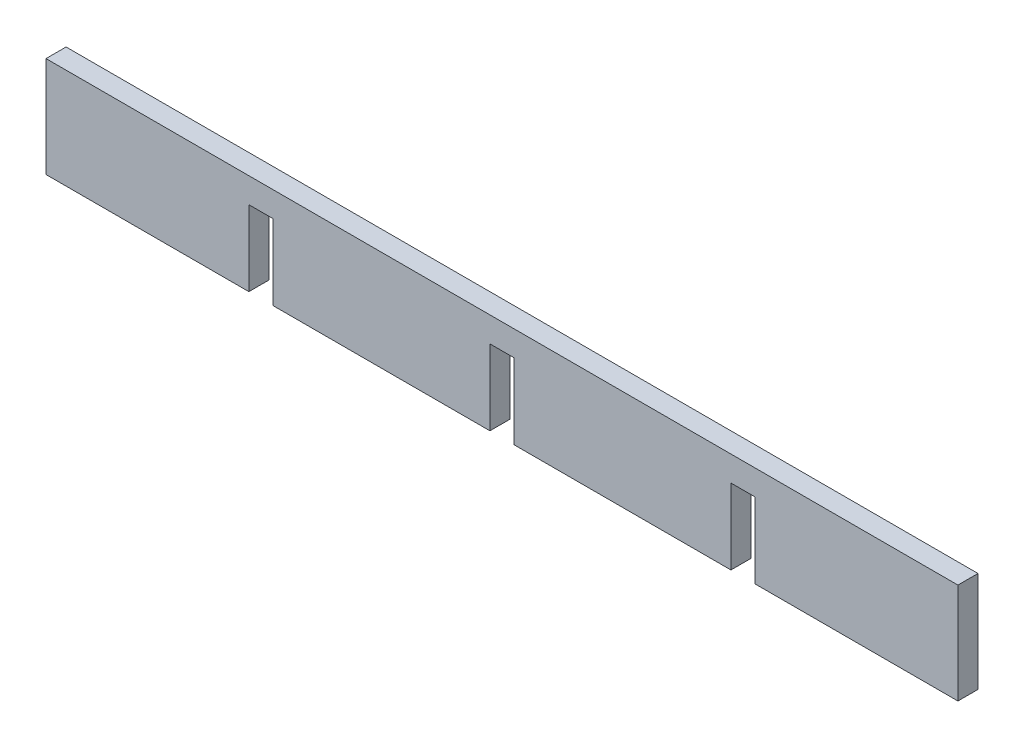
ISO-10303-21;
HEADER;
FILE_DESCRIPTION(('STEP AP214'),'2;1');
FILE_NAME('part.step','',(''),(''),'','','');
FILE_SCHEMA(('AUTOMOTIVE_DESIGN { 1 0 10303 214 1 1 1 1 }'));
ENDSEC;
DATA;
#1=APPLICATION_CONTEXT('core data for automotive mechanical design processes');
#2=APPLICATION_PROTOCOL_DEFINITION('international standard','automotive_design',2000,#1);
#3=PRODUCT_CONTEXT('',#1,'mechanical');
#4=PRODUCT('Part','Part','',(#3));
#5=PRODUCT_RELATED_PRODUCT_CATEGORY('part','',(#4));
#6=PRODUCT_DEFINITION_FORMATION('','',#4);
#7=PRODUCT_DEFINITION_CONTEXT('part definition',#1,'design');
#8=PRODUCT_DEFINITION('design','',#6,#7);
#9=PRODUCT_DEFINITION_SHAPE('','',#8);
#10=(LENGTH_UNIT() NAMED_UNIT(*) SI_UNIT(.MILLI.,.METRE.));
#11=(NAMED_UNIT(*) PLANE_ANGLE_UNIT() SI_UNIT($,.RADIAN.));
#12=(NAMED_UNIT(*) SI_UNIT($,.STERADIAN.) SOLID_ANGLE_UNIT());
#13=UNCERTAINTY_MEASURE_WITH_UNIT(LENGTH_MEASURE(1.E-05),#10,'distance_accuracy_value','');
#14=(GEOMETRIC_REPRESENTATION_CONTEXT(3) GLOBAL_UNCERTAINTY_ASSIGNED_CONTEXT((#13)) GLOBAL_UNIT_ASSIGNED_CONTEXT((#10,
#11,#12)) REPRESENTATION_CONTEXT('',''));
#15=CARTESIAN_POINT('',(0.,0.,0.));
#16=DIRECTION('',(0.,0.,1.));
#17=DIRECTION('',(1.,0.,0.));
#18=AXIS2_PLACEMENT_3D('',#15,#16,#17);
#19=CARTESIAN_POINT('',(-216.535,23.8125,6.35));
#20=DIRECTION('',(1.,0.,0.));
#21=DIRECTION('',(0.,0.,-1.));
#22=AXIS2_PLACEMENT_3D('',#19,#20,#21);
#23=PLANE('',#22);
#24=DIRECTION('',(0.,-1.,0.));
#25=VECTOR('',#24,1.);
#26=CARTESIAN_POINT('',(-216.535,23.8125,0.));
#27=LINE('',#26,#25);
#28=CARTESIAN_POINT('',(-216.535,23.8125,0.));
#29=VERTEX_POINT('',#28);
#30=CARTESIAN_POINT('',(-216.535,0.,0.));
#31=VERTEX_POINT('',#30);
#32=EDGE_CURVE('E188',#29,#31,#27,.T.);
#33=ORIENTED_EDGE('',*,*,#32,.T.);
#34=DIRECTION('',(0.,0.,-1.));
#35=VECTOR('',#34,1.);
#36=CARTESIAN_POINT('',(-216.535,0.,6.35));
#37=LINE('',#36,#35);
#38=CARTESIAN_POINT('',(-216.535,0.,6.35));
#39=VERTEX_POINT('',#38);
#40=EDGE_CURVE('E11',#39,#31,#37,.T.);
#41=ORIENTED_EDGE('',*,*,#40,.F.);
#42=DIRECTION('',(0.,-1.,0.));
#43=VECTOR('',#42,1.);
#44=CARTESIAN_POINT('',(-216.535,23.8125,6.35));
#45=LINE('',#44,#43);
#46=CARTESIAN_POINT('',(-216.535,23.8125,6.35));
#47=VERTEX_POINT('',#46);
#48=EDGE_CURVE('E234',#47,#39,#45,.T.);
#49=ORIENTED_EDGE('',*,*,#48,.F.);
#50=DIRECTION('',(0.,0.,-1.));
#51=VECTOR('',#50,1.);
#52=CARTESIAN_POINT('',(-216.535,23.8125,6.35));
#53=LINE('',#52,#51);
#54=EDGE_CURVE('E184',#47,#29,#53,.T.);
#55=ORIENTED_EDGE('',*,*,#54,.T.);
#56=EDGE_LOOP('',(#33,#41,#49,#55));
#57=FACE_BOUND('',#56,.T.);
#58=ADVANCED_FACE('F39',(#57),#23,.F.);
#59=CARTESIAN_POINT('',(-216.535,0.,6.35));
#60=DIRECTION('',(0.,1.,0.));
#61=DIRECTION('',(0.,0.,1.));
#62=AXIS2_PLACEMENT_3D('',#59,#60,#61);
#63=PLANE('',#62);
#64=DIRECTION('',(1.,0.,0.));
#65=VECTOR('',#64,1.);
#66=CARTESIAN_POINT('',(-216.535,0.,0.));
#67=LINE('',#66,#65);
#68=CARTESIAN_POINT('',(-147.955,0.,0.));
#69=VERTEX_POINT('',#68);
#70=EDGE_CURVE('E192',#31,#69,#67,.T.);
#71=ORIENTED_EDGE('',*,*,#70,.T.);
#72=DIRECTION('',(0.,0.,-1.));
#73=VECTOR('',#72,1.);
#74=CARTESIAN_POINT('',(-147.955,0.,6.35));
#75=LINE('',#74,#73);
#76=CARTESIAN_POINT('',(-147.955,0.,6.35));
#77=VERTEX_POINT('',#76);
#78=EDGE_CURVE('E48',#77,#69,#75,.T.);
#79=ORIENTED_EDGE('',*,*,#78,.F.);
#80=DIRECTION('',(1.,0.,0.));
#81=VECTOR('',#80,1.);
#82=CARTESIAN_POINT('',(-216.535,0.,6.35));
#83=LINE('',#82,#81);
#84=EDGE_CURVE('E123',#39,#77,#83,.T.);
#85=ORIENTED_EDGE('',*,*,#84,.F.);
#86=ORIENTED_EDGE('',*,*,#40,.T.);
#87=EDGE_LOOP('',(#71,#79,#85,#86));
#88=FACE_BOUND('',#87,.T.);
#89=ADVANCED_FACE('F356',(#88),#63,.F.);
#90=CARTESIAN_POINT('',(-147.955,0.,6.35));
#91=DIRECTION('',(-1.,0.,0.));
#92=DIRECTION('',(0.,0.,1.));
#93=AXIS2_PLACEMENT_3D('',#90,#91,#92);
#94=PLANE('',#93);
#95=DIRECTION('',(0.,1.,0.));
#96=VECTOR('',#95,1.);
#97=CARTESIAN_POINT('',(-147.955,0.,0.));
#98=LINE('',#97,#96);
#99=CARTESIAN_POINT('',(-147.955,23.8125,0.));
#100=VERTEX_POINT('',#99);
#101=EDGE_CURVE('E195',#69,#100,#98,.T.);
#102=ORIENTED_EDGE('',*,*,#101,.T.);
#103=DIRECTION('',(0.,0.,-1.));
#104=VECTOR('',#103,1.);
#105=CARTESIAN_POINT('',(-147.955,23.8125,6.35));
#106=LINE('',#105,#104);
#107=CARTESIAN_POINT('',(-147.955,23.8125,6.35));
#108=VERTEX_POINT('',#107);
#109=EDGE_CURVE('E277',#108,#100,#106,.T.);
#110=ORIENTED_EDGE('',*,*,#109,.F.);
#111=DIRECTION('',(0.,1.,0.));
#112=VECTOR('',#111,1.);
#113=CARTESIAN_POINT('',(-147.955,0.,6.35));
#114=LINE('',#113,#112);
#115=EDGE_CURVE('E287',#77,#108,#114,.T.);
#116=ORIENTED_EDGE('',*,*,#115,.F.);
#117=ORIENTED_EDGE('',*,*,#78,.T.);
#118=EDGE_LOOP('',(#102,#110,#116,#117));
#119=FACE_BOUND('',#118,.T.);
#120=ADVANCED_FACE('F285',(#119),#94,.F.);
#121=CARTESIAN_POINT('',(-147.955,23.8125,6.35));
#122=DIRECTION('',(0.,1.,0.));
#123=DIRECTION('',(0.,0.,1.));
#124=AXIS2_PLACEMENT_3D('',#121,#122,#123);
#125=PLANE('',#124);
#126=DIRECTION('',(1.,0.,0.));
#127=VECTOR('',#126,1.);
#128=CARTESIAN_POINT('',(-147.955,23.8125,0.));
#129=LINE('',#128,#127);
#130=CARTESIAN_POINT('',(-140.335,23.8125,0.));
#131=VERTEX_POINT('',#130);
#132=EDGE_CURVE('E198',#100,#131,#129,.T.);
#133=ORIENTED_EDGE('',*,*,#132,.T.);
#134=DIRECTION('',(0.,0.,-1.));
#135=VECTOR('',#134,1.);
#136=CARTESIAN_POINT('',(-140.335,23.8125,6.35));
#137=LINE('',#136,#135);
#138=CARTESIAN_POINT('',(-140.335,23.8125,6.35));
#139=VERTEX_POINT('',#138);
#140=EDGE_CURVE('E273',#139,#131,#137,.T.);
#141=ORIENTED_EDGE('',*,*,#140,.F.);
#142=DIRECTION('',(1.,0.,0.));
#143=VECTOR('',#142,1.);
#144=CARTESIAN_POINT('',(-147.955,23.8125,6.35));
#145=LINE('',#144,#143);
#146=EDGE_CURVE('E306',#108,#139,#145,.T.);
#147=ORIENTED_EDGE('',*,*,#146,.F.);
#148=ORIENTED_EDGE('',*,*,#109,.T.);
#149=EDGE_LOOP('',(#133,#141,#147,#148));
#150=FACE_BOUND('',#149,.T.);
#151=ADVANCED_FACE('F296',(#150),#125,.F.);
#152=CARTESIAN_POINT('',(-140.335,23.8125,6.35));
#153=DIRECTION('',(1.,0.,0.));
#154=DIRECTION('',(0.,0.,-1.));
#155=AXIS2_PLACEMENT_3D('',#152,#153,#154);
#156=PLANE('',#155);
#157=DIRECTION('',(0.,-1.,0.));
#158=VECTOR('',#157,1.);
#159=CARTESIAN_POINT('',(-140.335,23.8125,0.));
#160=LINE('',#159,#158);
#161=CARTESIAN_POINT('',(-140.335,0.,0.));
#162=VERTEX_POINT('',#161);
#163=EDGE_CURVE('E201',#131,#162,#160,.T.);
#164=ORIENTED_EDGE('',*,*,#163,.T.);
#165=DIRECTION('',(0.,0.,-1.));
#166=VECTOR('',#165,1.);
#167=CARTESIAN_POINT('',(-140.335,0.,6.35));
#168=LINE('',#167,#166);
#169=CARTESIAN_POINT('',(-140.335,0.,6.35));
#170=VERTEX_POINT('',#169);
#171=EDGE_CURVE('E269',#170,#162,#168,.T.);
#172=ORIENTED_EDGE('',*,*,#171,.F.);
#173=DIRECTION('',(0.,-1.,0.));
#174=VECTOR('',#173,1.);
#175=CARTESIAN_POINT('',(-140.335,23.8125,6.35));
#176=LINE('',#175,#174);
#177=EDGE_CURVE('E302',#139,#170,#176,.T.);
#178=ORIENTED_EDGE('',*,*,#177,.F.);
#179=ORIENTED_EDGE('',*,*,#140,.T.);
#180=EDGE_LOOP('',(#164,#172,#178,#179));
#181=FACE_BOUND('',#180,.T.);
#182=ADVANCED_FACE('F300',(#181),#156,.F.);
#183=CARTESIAN_POINT('',(-140.335,0.,6.35));
#184=DIRECTION('',(0.,1.,0.));
#185=DIRECTION('',(0.,0.,1.));
#186=AXIS2_PLACEMENT_3D('',#183,#184,#185);
#187=PLANE('',#186);
#188=DIRECTION('',(1.,0.,0.));
#189=VECTOR('',#188,1.);
#190=CARTESIAN_POINT('',(-140.335,0.,0.));
#191=LINE('',#190,#189);
#192=CARTESIAN_POINT('',(-71.755,0.,0.));
#193=VERTEX_POINT('',#192);
#194=EDGE_CURVE('E204',#162,#193,#191,.T.);
#195=ORIENTED_EDGE('',*,*,#194,.T.);
#196=DIRECTION('',(0.,0.,-1.));
#197=VECTOR('',#196,1.);
#198=CARTESIAN_POINT('',(-71.755,0.,6.35));
#199=LINE('',#198,#197);
#200=CARTESIAN_POINT('',(-71.755,0.,6.35));
#201=VERTEX_POINT('',#200);
#202=EDGE_CURVE('E265',#201,#193,#199,.T.);
#203=ORIENTED_EDGE('',*,*,#202,.F.);
#204=DIRECTION('',(1.,0.,0.));
#205=VECTOR('',#204,1.);
#206=CARTESIAN_POINT('',(-140.335,0.,6.35));
#207=LINE('',#206,#205);
#208=EDGE_CURVE('E305',#170,#201,#207,.T.);
#209=ORIENTED_EDGE('',*,*,#208,.F.);
#210=ORIENTED_EDGE('',*,*,#171,.T.);
#211=EDGE_LOOP('',(#195,#203,#209,#210));
#212=FACE_BOUND('',#211,.T.);
#213=ADVANCED_FACE('F369',(#212),#187,.F.);
#214=CARTESIAN_POINT('',(-71.755,0.,6.35));
#215=DIRECTION('',(-1.,0.,0.));
#216=DIRECTION('',(0.,0.,1.));
#217=AXIS2_PLACEMENT_3D('',#214,#215,#216);
#218=PLANE('',#217);
#219=DIRECTION('',(0.,1.,0.));
#220=VECTOR('',#219,1.);
#221=CARTESIAN_POINT('',(-71.755,0.,0.));
#222=LINE('',#221,#220);
#223=CARTESIAN_POINT('',(-71.755,23.8125,0.));
#224=VERTEX_POINT('',#223);
#225=EDGE_CURVE('E207',#193,#224,#222,.T.);
#226=ORIENTED_EDGE('',*,*,#225,.T.);
#227=DIRECTION('',(0.,0.,-1.));
#228=VECTOR('',#227,1.);
#229=CARTESIAN_POINT('',(-71.755,23.8125,6.35));
#230=LINE('',#229,#228);
#231=CARTESIAN_POINT('',(-71.755,23.8125,6.35));
#232=VERTEX_POINT('',#231);
#233=EDGE_CURVE('E261',#232,#224,#230,.T.);
#234=ORIENTED_EDGE('',*,*,#233,.F.);
#235=DIRECTION('',(0.,1.,0.));
#236=VECTOR('',#235,1.);
#237=CARTESIAN_POINT('',(-71.755,0.,6.35));
#238=LINE('',#237,#236);
#239=EDGE_CURVE('E310',#201,#232,#238,.T.);
#240=ORIENTED_EDGE('',*,*,#239,.F.);
#241=ORIENTED_EDGE('',*,*,#202,.T.);
#242=EDGE_LOOP('',(#226,#234,#240,#241));
#243=FACE_BOUND('',#242,.T.);
#244=ADVANCED_FACE('F372',(#243),#218,.F.);
#245=CARTESIAN_POINT('',(-71.755,23.8125,6.35));
#246=DIRECTION('',(0.,1.,0.));
#247=DIRECTION('',(0.,0.,1.));
#248=AXIS2_PLACEMENT_3D('',#245,#246,#247);
#249=PLANE('',#248);
#250=DIRECTION('',(1.,0.,0.));
#251=VECTOR('',#250,1.);
#252=CARTESIAN_POINT('',(-71.755,23.8125,0.));
#253=LINE('',#252,#251);
#254=CARTESIAN_POINT('',(-64.135,23.8125,0.));
#255=VERTEX_POINT('',#254);
#256=EDGE_CURVE('E210',#224,#255,#253,.T.);
#257=ORIENTED_EDGE('',*,*,#256,.T.);
#258=DIRECTION('',(0.,0.,-1.));
#259=VECTOR('',#258,1.);
#260=CARTESIAN_POINT('',(-64.135,23.8125,6.35));
#261=LINE('',#260,#259);
#262=CARTESIAN_POINT('',(-64.135,23.8125,6.35));
#263=VERTEX_POINT('',#262);
#264=EDGE_CURVE('E257',#263,#255,#261,.T.);
#265=ORIENTED_EDGE('',*,*,#264,.F.);
#266=DIRECTION('',(1.,0.,0.));
#267=VECTOR('',#266,1.);
#268=CARTESIAN_POINT('',(-71.755,23.8125,6.35));
#269=LINE('',#268,#267);
#270=EDGE_CURVE('E317',#232,#263,#269,.T.);
#271=ORIENTED_EDGE('',*,*,#270,.F.);
#272=ORIENTED_EDGE('',*,*,#233,.T.);
#273=EDGE_LOOP('',(#257,#265,#271,#272));
#274=FACE_BOUND('',#273,.T.);
#275=ADVANCED_FACE('F376',(#274),#249,.F.);
#276=CARTESIAN_POINT('',(-64.135,23.8125,6.35));
#277=DIRECTION('',(1.,0.,0.));
#278=DIRECTION('',(0.,0.,-1.));
#279=AXIS2_PLACEMENT_3D('',#276,#277,#278);
#280=PLANE('',#279);
#281=DIRECTION('',(0.,-1.,0.));
#282=VECTOR('',#281,1.);
#283=CARTESIAN_POINT('',(-64.135,23.8125,0.));
#284=LINE('',#283,#282);
#285=CARTESIAN_POINT('',(-64.135,0.,0.));
#286=VERTEX_POINT('',#285);
#287=EDGE_CURVE('E213',#255,#286,#284,.T.);
#288=ORIENTED_EDGE('',*,*,#287,.T.);
#289=DIRECTION('',(0.,0.,-1.));
#290=VECTOR('',#289,1.);
#291=CARTESIAN_POINT('',(-64.135,0.,6.35));
#292=LINE('',#291,#290);
#293=CARTESIAN_POINT('',(-64.135,0.,6.35));
#294=VERTEX_POINT('',#293);
#295=EDGE_CURVE('E253',#294,#286,#292,.T.);
#296=ORIENTED_EDGE('',*,*,#295,.F.);
#297=DIRECTION('',(0.,-1.,0.));
#298=VECTOR('',#297,1.);
#299=CARTESIAN_POINT('',(-64.135,23.8125,6.35));
#300=LINE('',#299,#298);
#301=EDGE_CURVE('E320',#263,#294,#300,.T.);
#302=ORIENTED_EDGE('',*,*,#301,.F.);
#303=ORIENTED_EDGE('',*,*,#264,.T.);
#304=EDGE_LOOP('',(#288,#296,#302,#303));
#305=FACE_BOUND('',#304,.T.);
#306=ADVANCED_FACE('F380',(#305),#280,.F.);
#307=CARTESIAN_POINT('',(-64.135,0.,6.35));
#308=DIRECTION('',(0.,1.,0.));
#309=DIRECTION('',(0.,0.,1.));
#310=AXIS2_PLACEMENT_3D('',#307,#308,#309);
#311=PLANE('',#310);
#312=DIRECTION('',(1.,0.,0.));
#313=VECTOR('',#312,1.);
#314=CARTESIAN_POINT('',(-64.135,0.,0.));
#315=LINE('',#314,#313);
#316=CARTESIAN_POINT('',(0.,0.,0.));
#317=VERTEX_POINT('',#316);
#318=EDGE_CURVE('E216',#286,#317,#315,.T.);
#319=ORIENTED_EDGE('',*,*,#318,.T.);
#320=DIRECTION('',(0.,0.,-1.));
#321=VECTOR('',#320,1.);
#322=CARTESIAN_POINT('',(0.,0.,6.35));
#323=LINE('',#322,#321);
#324=CARTESIAN_POINT('',(0.,0.,6.35));
#325=VERTEX_POINT('',#324);
#326=EDGE_CURVE('E249',#325,#317,#323,.T.);
#327=ORIENTED_EDGE('',*,*,#326,.F.);
#328=DIRECTION('',(1.,0.,0.));
#329=VECTOR('',#328,1.);
#330=CARTESIAN_POINT('',(-64.135,0.,6.35));
#331=LINE('',#330,#329);
#332=EDGE_CURVE('E323',#294,#325,#331,.T.);
#333=ORIENTED_EDGE('',*,*,#332,.F.);
#334=ORIENTED_EDGE('',*,*,#295,.T.);
#335=EDGE_LOOP('',(#319,#327,#333,#334));
#336=FACE_BOUND('',#335,.T.);
#337=ADVANCED_FACE('F384',(#336),#311,.F.);
#338=CARTESIAN_POINT('',(0.,0.,6.35));
#339=DIRECTION('',(-1.,0.,0.));
#340=DIRECTION('',(0.,0.,1.));
#341=AXIS2_PLACEMENT_3D('',#338,#339,#340);
#342=PLANE('',#341);
#343=DIRECTION('',(0.,1.,0.));
#344=VECTOR('',#343,1.);
#345=CARTESIAN_POINT('',(0.,0.,0.));
#346=LINE('',#345,#344);
#347=CARTESIAN_POINT('',(0.,31.75,0.));
#348=VERTEX_POINT('',#347);
#349=EDGE_CURVE('E219',#317,#348,#346,.T.);
#350=ORIENTED_EDGE('',*,*,#349,.T.);
#351=DIRECTION('',(0.,0.,-1.));
#352=VECTOR('',#351,1.);
#353=CARTESIAN_POINT('',(0.,31.75,6.35));
#354=LINE('',#353,#352);
#355=CARTESIAN_POINT('',(0.,31.75,6.35));
#356=VERTEX_POINT('',#355);
#357=EDGE_CURVE('E245',#356,#348,#354,.T.);
#358=ORIENTED_EDGE('',*,*,#357,.F.);
#359=DIRECTION('',(0.,1.,0.));
#360=VECTOR('',#359,1.);
#361=CARTESIAN_POINT('',(0.,0.,6.35));
#362=LINE('',#361,#360);
#363=EDGE_CURVE('E326',#325,#356,#362,.T.);
#364=ORIENTED_EDGE('',*,*,#363,.F.);
#365=ORIENTED_EDGE('',*,*,#326,.T.);
#366=EDGE_LOOP('',(#350,#358,#364,#365));
#367=FACE_BOUND('',#366,.T.);
#368=ADVANCED_FACE('F388',(#367),#342,.F.);
#369=CARTESIAN_POINT('',(0.,31.75,6.35));
#370=DIRECTION('',(0.,-1.,0.));
#371=DIRECTION('',(0.,0.,-1.));
#372=AXIS2_PLACEMENT_3D('',#369,#370,#371);
#373=PLANE('',#372);
#374=DIRECTION('',(-1.,0.,0.));
#375=VECTOR('',#374,1.);
#376=CARTESIAN_POINT('',(0.,31.75,0.));
#377=LINE('',#376,#375);
#378=CARTESIAN_POINT('',(-288.29,31.75,0.));
#379=VERTEX_POINT('',#378);
#380=EDGE_CURVE('E222',#348,#379,#377,.T.);
#381=ORIENTED_EDGE('',*,*,#380,.T.);
#382=DIRECTION('',(0.,0.,-1.));
#383=VECTOR('',#382,1.);
#384=CARTESIAN_POINT('',(-288.29,31.75,6.35));
#385=LINE('',#384,#383);
#386=CARTESIAN_POINT('',(-288.29,31.75,6.35));
#387=VERTEX_POINT('',#386);
#388=EDGE_CURVE('E241',#387,#379,#385,.T.);
#389=ORIENTED_EDGE('',*,*,#388,.F.);
#390=DIRECTION('',(-1.,0.,0.));
#391=VECTOR('',#390,1.);
#392=CARTESIAN_POINT('',(0.,31.75,6.35));
#393=LINE('',#392,#391);
#394=EDGE_CURVE('E329',#356,#387,#393,.T.);
#395=ORIENTED_EDGE('',*,*,#394,.F.);
#396=ORIENTED_EDGE('',*,*,#357,.T.);
#397=EDGE_LOOP('',(#381,#389,#395,#396));
#398=FACE_BOUND('',#397,.T.);
#399=ADVANCED_FACE('F337',(#398),#373,.F.);
#400=CARTESIAN_POINT('',(-288.29,31.75,6.35));
#401=DIRECTION('',(1.,0.,0.));
#402=DIRECTION('',(0.,0.,-1.));
#403=AXIS2_PLACEMENT_3D('',#400,#401,#402);
#404=PLANE('',#403);
#405=DIRECTION('',(0.,-1.,0.));
#406=VECTOR('',#405,1.);
#407=CARTESIAN_POINT('',(-288.29,31.75,0.));
#408=LINE('',#407,#406);
#409=CARTESIAN_POINT('',(-288.29,0.,0.));
#410=VERTEX_POINT('',#409);
#411=EDGE_CURVE('E225',#379,#410,#408,.T.);
#412=ORIENTED_EDGE('',*,*,#411,.T.);
#413=DIRECTION('',(0.,0.,-1.));
#414=VECTOR('',#413,1.);
#415=CARTESIAN_POINT('',(-288.29,0.,6.35));
#416=LINE('',#415,#414);
#417=CARTESIAN_POINT('',(-288.29,0.,6.35));
#418=VERTEX_POINT('',#417);
#419=EDGE_CURVE('E177',#418,#410,#416,.T.);
#420=ORIENTED_EDGE('',*,*,#419,.F.);
#421=DIRECTION('',(0.,-1.,0.));
#422=VECTOR('',#421,1.);
#423=CARTESIAN_POINT('',(-288.29,31.75,6.35));
#424=LINE('',#423,#422);
#425=EDGE_CURVE('E166',#387,#418,#424,.T.);
#426=ORIENTED_EDGE('',*,*,#425,.F.);
#427=ORIENTED_EDGE('',*,*,#388,.T.);
#428=EDGE_LOOP('',(#412,#420,#426,#427));
#429=FACE_BOUND('',#428,.T.);
#430=ADVANCED_FACE('F341',(#429),#404,.F.);
#431=CARTESIAN_POINT('',(-288.29,0.,6.35));
#432=DIRECTION('',(0.,1.,0.));
#433=DIRECTION('',(0.,0.,1.));
#434=AXIS2_PLACEMENT_3D('',#431,#432,#433);
#435=PLANE('',#434);
#436=DIRECTION('',(1.,0.,0.));
#437=VECTOR('',#436,1.);
#438=CARTESIAN_POINT('',(-288.29,0.,0.));
#439=LINE('',#438,#437);
#440=CARTESIAN_POINT('',(-224.155,0.,0.));
#441=VERTEX_POINT('',#440);
#442=EDGE_CURVE('E175',#410,#441,#439,.T.);
#443=ORIENTED_EDGE('',*,*,#442,.T.);
#444=DIRECTION('',(0.,0.,-1.));
#445=VECTOR('',#444,1.);
#446=CARTESIAN_POINT('',(-224.155,0.,6.35));
#447=LINE('',#446,#445);
#448=CARTESIAN_POINT('',(-224.155,0.,6.35));
#449=VERTEX_POINT('',#448);
#450=EDGE_CURVE('E172',#449,#441,#447,.T.);
#451=ORIENTED_EDGE('',*,*,#450,.F.);
#452=DIRECTION('',(1.,0.,0.));
#453=VECTOR('',#452,1.);
#454=CARTESIAN_POINT('',(-288.29,0.,6.35));
#455=LINE('',#454,#453);
#456=EDGE_CURVE('E160',#418,#449,#455,.T.);
#457=ORIENTED_EDGE('',*,*,#456,.F.);
#458=ORIENTED_EDGE('',*,*,#419,.T.);
#459=EDGE_LOOP('',(#443,#451,#457,#458));
#460=FACE_BOUND('',#459,.T.);
#461=ADVANCED_FACE('F173',(#460),#435,.F.);
#462=CARTESIAN_POINT('',(-224.155,0.,6.35));
#463=DIRECTION('',(-1.,0.,0.));
#464=DIRECTION('',(0.,0.,1.));
#465=AXIS2_PLACEMENT_3D('',#462,#463,#464);
#466=PLANE('',#465);
#467=DIRECTION('',(0.,1.,0.));
#468=VECTOR('',#467,1.);
#469=CARTESIAN_POINT('',(-224.155,0.,0.));
#470=LINE('',#469,#468);
#471=CARTESIAN_POINT('',(-224.155,23.8125,0.));
#472=VERTEX_POINT('',#471);
#473=EDGE_CURVE('E109',#441,#472,#470,.T.);
#474=ORIENTED_EDGE('',*,*,#473,.T.);
#475=DIRECTION('',(0.,0.,-1.));
#476=VECTOR('',#475,1.);
#477=CARTESIAN_POINT('',(-224.155,23.8125,6.35));
#478=LINE('',#477,#476);
#479=CARTESIAN_POINT('',(-224.155,23.8125,6.35));
#480=VERTEX_POINT('',#479);
#481=EDGE_CURVE('E178',#480,#472,#478,.T.);
#482=ORIENTED_EDGE('',*,*,#481,.F.);
#483=DIRECTION('',(0.,1.,0.));
#484=VECTOR('',#483,1.);
#485=CARTESIAN_POINT('',(-224.155,0.,6.35));
#486=LINE('',#485,#484);
#487=EDGE_CURVE('E164',#449,#480,#486,.T.);
#488=ORIENTED_EDGE('',*,*,#487,.F.);
#489=ORIENTED_EDGE('',*,*,#450,.T.);
#490=EDGE_LOOP('',(#474,#482,#488,#489));
#491=FACE_BOUND('',#490,.T.);
#492=ADVANCED_FACE('F180',(#491),#466,.F.);
#493=CARTESIAN_POINT('',(-224.155,23.8125,6.35));
#494=DIRECTION('',(0.,1.,0.));
#495=DIRECTION('',(0.,0.,1.));
#496=AXIS2_PLACEMENT_3D('',#493,#494,#495);
#497=PLANE('',#496);
#498=DIRECTION('',(1.,0.,0.));
#499=VECTOR('',#498,1.);
#500=CARTESIAN_POINT('',(-224.155,23.8125,0.));
#501=LINE('',#500,#499);
#502=EDGE_CURVE('E115',#472,#29,#501,.T.);
#503=ORIENTED_EDGE('',*,*,#502,.T.);
#504=ORIENTED_EDGE('',*,*,#54,.F.);
#505=DIRECTION('',(1.,0.,0.));
#506=VECTOR('',#505,1.);
#507=CARTESIAN_POINT('',(-224.155,23.8125,6.35));
#508=LINE('',#507,#506);
#509=EDGE_CURVE('E56',#480,#47,#508,.T.);
#510=ORIENTED_EDGE('',*,*,#509,.F.);
#511=ORIENTED_EDGE('',*,*,#481,.T.);
#512=EDGE_LOOP('',(#503,#504,#510,#511));
#513=FACE_BOUND('',#512,.T.);
#514=ADVANCED_FACE('F345',(#513),#497,.F.);
#515=CARTESIAN_POINT('',(0.,0.,6.35));
#516=DIRECTION('',(0.,0.,1.));
#517=DIRECTION('',(1.,0.,0.));
#518=AXIS2_PLACEMENT_3D('',#515,#516,#517);
#519=PLANE('',#518);
#520=ORIENTED_EDGE('',*,*,#48,.T.);
#521=ORIENTED_EDGE('',*,*,#84,.T.);
#522=ORIENTED_EDGE('',*,*,#115,.T.);
#523=ORIENTED_EDGE('',*,*,#146,.T.);
#524=ORIENTED_EDGE('',*,*,#177,.T.);
#525=ORIENTED_EDGE('',*,*,#208,.T.);
#526=ORIENTED_EDGE('',*,*,#239,.T.);
#527=ORIENTED_EDGE('',*,*,#270,.T.);
#528=ORIENTED_EDGE('',*,*,#301,.T.);
#529=ORIENTED_EDGE('',*,*,#332,.T.);
#530=ORIENTED_EDGE('',*,*,#363,.T.);
#531=ORIENTED_EDGE('',*,*,#394,.T.);
#532=ORIENTED_EDGE('',*,*,#425,.T.);
#533=ORIENTED_EDGE('',*,*,#456,.T.);
#534=ORIENTED_EDGE('',*,*,#487,.T.);
#535=ORIENTED_EDGE('',*,*,#509,.T.);
#536=EDGE_LOOP('',(#520,#521,#522,#523,#524,#525,#526,#527,#528,#529,#530,#531,#532,#533,#534,#535));
#537=FACE_BOUND('',#536,.T.);
#538=ADVANCED_FACE('F162',(#537),#519,.T.);
#539=CARTESIAN_POINT('',(0.,0.,0.));
#540=DIRECTION('',(0.,0.,1.));
#541=DIRECTION('',(1.,0.,0.));
#542=AXIS2_PLACEMENT_3D('',#539,#540,#541);
#543=PLANE('',#542);
#544=ORIENTED_EDGE('',*,*,#32,.F.);
#545=ORIENTED_EDGE('',*,*,#502,.F.);
#546=ORIENTED_EDGE('',*,*,#473,.F.);
#547=ORIENTED_EDGE('',*,*,#442,.F.);
#548=ORIENTED_EDGE('',*,*,#411,.F.);
#549=ORIENTED_EDGE('',*,*,#380,.F.);
#550=ORIENTED_EDGE('',*,*,#349,.F.);
#551=ORIENTED_EDGE('',*,*,#318,.F.);
#552=ORIENTED_EDGE('',*,*,#287,.F.);
#553=ORIENTED_EDGE('',*,*,#256,.F.);
#554=ORIENTED_EDGE('',*,*,#225,.F.);
#555=ORIENTED_EDGE('',*,*,#194,.F.);
#556=ORIENTED_EDGE('',*,*,#163,.F.);
#557=ORIENTED_EDGE('',*,*,#132,.F.);
#558=ORIENTED_EDGE('',*,*,#101,.F.);
#559=ORIENTED_EDGE('',*,*,#70,.F.);
#560=EDGE_LOOP('',(#544,#545,#546,#547,#548,#549,#550,#551,#552,#553,#554,#555,#556,#557,#558,#559));
#561=FACE_BOUND('',#560,.T.);
#562=ADVANCED_FACE('F291',(#561),#543,.F.);
#563=CLOSED_SHELL('',(#58,#89,#120,#151,#182,#213,#244,#275,#306,#337,#368,#399,#430,#461,#492,
#514,#538,#562));
#564=MANIFOLD_SOLID_BREP('B2',#563);
#565=ADVANCED_BREP_SHAPE_REPRESENTATION('',(#18,#564),#14);
#566=SHAPE_DEFINITION_REPRESENTATION(#9,#565);
ENDSEC;
END-ISO-10303-21;
